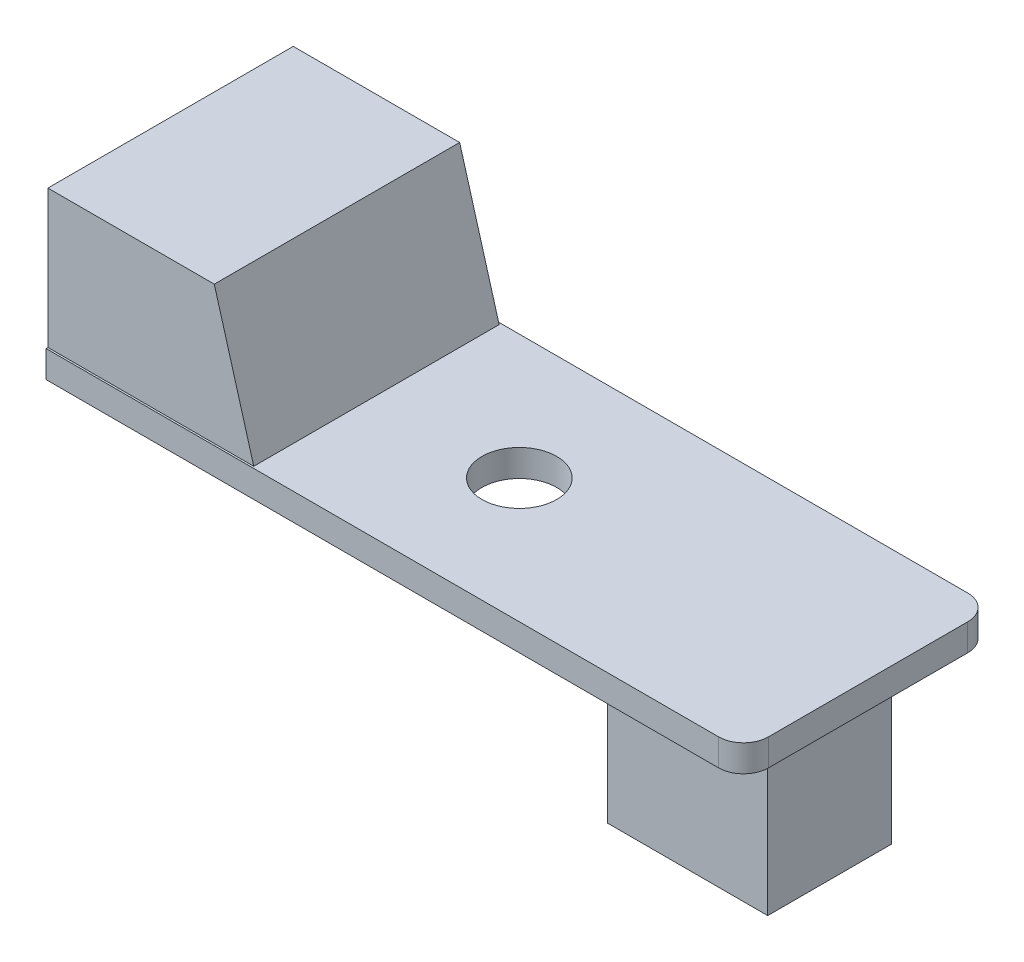
ISO-10303-21;
HEADER;
FILE_DESCRIPTION(('STEP AP214'),'2;1');
FILE_NAME('part.step','',(''),(''),'','','');
FILE_SCHEMA(('AUTOMOTIVE_DESIGN { 1 0 10303 214 1 1 1 1 }'));
ENDSEC;
DATA;
#1=APPLICATION_CONTEXT('core data for automotive mechanical design processes');
#2=APPLICATION_PROTOCOL_DEFINITION('international standard','automotive_design',2000,#1);
#3=PRODUCT_CONTEXT('',#1,'mechanical');
#4=PRODUCT('Part','Part','',(#3));
#5=PRODUCT_RELATED_PRODUCT_CATEGORY('part','',(#4));
#6=PRODUCT_DEFINITION_FORMATION('','',#4);
#7=PRODUCT_DEFINITION_CONTEXT('part definition',#1,'design');
#8=PRODUCT_DEFINITION('design','',#6,#7);
#9=PRODUCT_DEFINITION_SHAPE('','',#8);
#10=(LENGTH_UNIT() NAMED_UNIT(*) SI_UNIT(.MILLI.,.METRE.));
#11=(NAMED_UNIT(*) PLANE_ANGLE_UNIT() SI_UNIT($,.RADIAN.));
#12=(NAMED_UNIT(*) SI_UNIT($,.STERADIAN.) SOLID_ANGLE_UNIT());
#13=UNCERTAINTY_MEASURE_WITH_UNIT(LENGTH_MEASURE(1.E-05),#10,'distance_accuracy_value','');
#14=(GEOMETRIC_REPRESENTATION_CONTEXT(3) GLOBAL_UNCERTAINTY_ASSIGNED_CONTEXT((#13)) GLOBAL_UNIT_ASSIGNED_CONTEXT((#10,
#11,#12)) REPRESENTATION_CONTEXT('',''));
#15=CARTESIAN_POINT('',(0.,0.,0.));
#16=DIRECTION('',(0.,0.,1.));
#17=DIRECTION('',(1.,0.,0.));
#18=AXIS2_PLACEMENT_3D('',#15,#16,#17);
#19=CARTESIAN_POINT('',(27.,0.,-1.));
#20=DIRECTION('',(0.,1.,0.));
#21=DIRECTION('',(0.,0.,1.));
#22=AXIS2_PLACEMENT_3D('',#19,#20,#21);
#23=PLANE('',#22);
#24=CARTESIAN_POINT('',(14.,0.,-5.));
#25=DIRECTION('',(0.,1.,0.));
#26=DIRECTION('',(0.,0.,1.));
#27=AXIS2_PLACEMENT_3D('',#24,#25,#26);
#28=CIRCLE('',#27,1.5);
#29=CARTESIAN_POINT('',(14.,0.,-3.5));
#30=VERTEX_POINT('',#29);
#31=EDGE_CURVE('E218',#30,#30,#28,.T.);
#32=ORIENTED_EDGE('',*,*,#31,.T.);
#33=EDGE_LOOP('',(#32));
#34=FACE_BOUND('',#33,.T.);
#35=DIRECTION('',(0.,0.,1.));
#36=VECTOR('',#35,1.);
#37=CARTESIAN_POINT('',(0.,0.,-10.));
#38=LINE('',#37,#36);
#39=CARTESIAN_POINT('',(0.,0.,-10.));
#40=VERTEX_POINT('',#39);
#41=CARTESIAN_POINT('',(0.,0.,0.));
#42=VERTEX_POINT('',#41);
#43=EDGE_CURVE('E223',#40,#42,#38,.T.);
#44=ORIENTED_EDGE('',*,*,#43,.F.);
#45=DIRECTION('',(-1.,0.,0.));
#46=VECTOR('',#45,1.);
#47=CARTESIAN_POINT('',(27.,0.,-10.));
#48=LINE('',#47,#46);
#49=CARTESIAN_POINT('',(27.,0.,-10.));
#50=VERTEX_POINT('',#49);
#51=EDGE_CURVE('E262',#50,#40,#48,.T.);
#52=ORIENTED_EDGE('',*,*,#51,.F.);
#53=CARTESIAN_POINT('',(27.,0.,-9.));
#54=DIRECTION('',(0.,1.,0.));
#55=DIRECTION('',(0.,0.,1.));
#56=AXIS2_PLACEMENT_3D('',#53,#54,#55);
#57=CIRCLE('',#56,1.);
#58=CARTESIAN_POINT('',(28.,0.,-8.99999999999999));
#59=VERTEX_POINT('',#58);
#60=EDGE_CURVE('E259',#59,#50,#57,.T.);
#61=ORIENTED_EDGE('',*,*,#60,.F.);
#62=DIRECTION('',(0.,0.,-1.));
#63=VECTOR('',#62,1.);
#64=CARTESIAN_POINT('',(28.,0.,-1.00000000000001));
#65=LINE('',#64,#63);
#66=CARTESIAN_POINT('',(28.,0.,-1.00000000000001));
#67=VERTEX_POINT('',#66);
#68=EDGE_CURVE('E256',#67,#59,#65,.T.);
#69=ORIENTED_EDGE('',*,*,#68,.F.);
#70=CARTESIAN_POINT('',(27.,0.,-1.));
#71=DIRECTION('',(0.,1.,0.));
#72=DIRECTION('',(0.,0.,1.));
#73=AXIS2_PLACEMENT_3D('',#70,#71,#72);
#74=CIRCLE('',#73,1.);
#75=CARTESIAN_POINT('',(27.,0.,0.));
#76=VERTEX_POINT('',#75);
#77=EDGE_CURVE('E253',#76,#67,#74,.T.);
#78=ORIENTED_EDGE('',*,*,#77,.F.);
#79=DIRECTION('',(1.,0.,0.));
#80=VECTOR('',#79,1.);
#81=CARTESIAN_POINT('',(0.,0.,0.));
#82=LINE('',#81,#80);
#83=EDGE_CURVE('E250',#42,#76,#82,.T.);
#84=ORIENTED_EDGE('',*,*,#83,.F.);
#85=EDGE_LOOP('',(#44,#52,#61,#69,#78,#84));
#86=FACE_BOUND('',#85,.T.);
#87=DIRECTION('',(-1.,0.,0.));
#88=VECTOR('',#87,1.);
#89=CARTESIAN_POINT('',(26.45,0.,-2.52));
#90=LINE('',#89,#88);
#91=CARTESIAN_POINT('',(26.45,0.,-2.52));
#92=VERTEX_POINT('',#91);
#93=CARTESIAN_POINT('',(20.02,0.,-2.52));
#94=VERTEX_POINT('',#93);
#95=EDGE_CURVE('E169',#92,#94,#90,.T.);
#96=ORIENTED_EDGE('',*,*,#95,.F.);
#97=DIRECTION('',(0.,0.,1.));
#98=VECTOR('',#97,1.);
#99=CARTESIAN_POINT('',(26.45,0.,-7.48));
#100=LINE('',#99,#98);
#101=CARTESIAN_POINT('',(26.45,0.,-7.48));
#102=VERTEX_POINT('',#101);
#103=EDGE_CURVE('E166',#102,#92,#100,.T.);
#104=ORIENTED_EDGE('',*,*,#103,.F.);
#105=DIRECTION('',(1.,0.,0.));
#106=VECTOR('',#105,1.);
#107=CARTESIAN_POINT('',(20.02,0.,-7.48));
#108=LINE('',#107,#106);
#109=CARTESIAN_POINT('',(20.02,0.,-7.48));
#110=VERTEX_POINT('',#109);
#111=EDGE_CURVE('E66',#110,#102,#108,.T.);
#112=ORIENTED_EDGE('',*,*,#111,.F.);
#113=DIRECTION('',(0.,0.,-1.));
#114=VECTOR('',#113,1.);
#115=CARTESIAN_POINT('',(20.02,0.,-2.52));
#116=LINE('',#115,#114);
#117=EDGE_CURVE('E61',#94,#110,#116,.T.);
#118=ORIENTED_EDGE('',*,*,#117,.F.);
#119=EDGE_LOOP('',(#96,#104,#112,#118));
#120=FACE_BOUND('',#119,.T.);
#121=ADVANCED_FACE('F45',(#34,#86,#120),#23,.F.);
#122=CARTESIAN_POINT('',(27.,1.08,-1.));
#123=DIRECTION('',(0.,1.,0.));
#124=DIRECTION('',(0.,0.,1.));
#125=AXIS2_PLACEMENT_3D('',#122,#123,#124);
#126=PLANE('',#125);
#127=CARTESIAN_POINT('',(14.,1.08,-5.));
#128=DIRECTION('',(0.,1.,0.));
#129=DIRECTION('',(0.,0.,1.));
#130=AXIS2_PLACEMENT_3D('',#127,#128,#129);
#131=CIRCLE('',#130,1.5);
#132=CARTESIAN_POINT('',(14.,1.08,-3.5));
#133=VERTEX_POINT('',#132);
#134=EDGE_CURVE('E219',#133,#133,#131,.T.);
#135=ORIENTED_EDGE('',*,*,#134,.F.);
#136=EDGE_LOOP('',(#135));
#137=FACE_BOUND('',#136,.T.);
#138=DIRECTION('',(-1.,0.,0.));
#139=VECTOR('',#138,1.);
#140=CARTESIAN_POINT('',(0.,1.08,-9.925));
#141=LINE('',#140,#139);
#142=CARTESIAN_POINT('',(8.26460256565403,1.08,-9.925));
#143=VERTEX_POINT('',#142);
#144=CARTESIAN_POINT('',(0.,1.08,-9.925));
#145=VERTEX_POINT('',#144);
#146=EDGE_CURVE('E194',#143,#145,#141,.T.);
#147=ORIENTED_EDGE('',*,*,#146,.F.);
#148=DIRECTION('',(0.,0.,1.));
#149=VECTOR('',#148,1.);
#150=CARTESIAN_POINT('',(8.26460256565403,1.08,-9.925));
#151=LINE('',#150,#149);
#152=CARTESIAN_POINT('',(8.26460256565403,1.08,-0.0750000000000019));
#153=VERTEX_POINT('',#152);
#154=EDGE_CURVE('E183',#143,#153,#151,.T.);
#155=ORIENTED_EDGE('',*,*,#154,.T.);
#156=DIRECTION('',(1.,0.,0.));
#157=VECTOR('',#156,1.);
#158=CARTESIAN_POINT('',(6.68,1.08,-0.0750000000000024));
#159=LINE('',#158,#157);
#160=CARTESIAN_POINT('',(0.,1.08,-0.0750000000000021));
#161=VERTEX_POINT('',#160);
#162=EDGE_CURVE('E188',#161,#153,#159,.T.);
#163=ORIENTED_EDGE('',*,*,#162,.F.);
#164=DIRECTION('',(0.,0.,1.));
#165=VECTOR('',#164,1.);
#166=CARTESIAN_POINT('',(0.,1.08,-10.));
#167=LINE('',#166,#165);
#168=CARTESIAN_POINT('',(0.,1.08,0.));
#169=VERTEX_POINT('',#168);
#170=EDGE_CURVE('E231',#161,#169,#167,.T.);
#171=ORIENTED_EDGE('',*,*,#170,.T.);
#172=DIRECTION('',(1.,0.,0.));
#173=VECTOR('',#172,1.);
#174=CARTESIAN_POINT('',(0.,1.08,0.));
#175=LINE('',#174,#173);
#176=CARTESIAN_POINT('',(27.,1.08,0.));
#177=VERTEX_POINT('',#176);
#178=EDGE_CURVE('E230',#169,#177,#175,.T.);
#179=ORIENTED_EDGE('',*,*,#178,.T.);
#180=CARTESIAN_POINT('',(27.,1.08,-1.));
#181=DIRECTION('',(0.,1.,0.));
#182=DIRECTION('',(0.,0.,1.));
#183=AXIS2_PLACEMENT_3D('',#180,#181,#182);
#184=CIRCLE('',#183,1.);
#185=CARTESIAN_POINT('',(28.,1.08,-1.00000000000001));
#186=VERTEX_POINT('',#185);
#187=EDGE_CURVE('E234',#177,#186,#184,.T.);
#188=ORIENTED_EDGE('',*,*,#187,.T.);
#189=DIRECTION('',(0.,0.,-1.));
#190=VECTOR('',#189,1.);
#191=CARTESIAN_POINT('',(28.,1.08,-1.00000000000001));
#192=LINE('',#191,#190);
#193=CARTESIAN_POINT('',(28.,1.08,-8.99999999999999));
#194=VERTEX_POINT('',#193);
#195=EDGE_CURVE('E237',#186,#194,#192,.T.);
#196=ORIENTED_EDGE('',*,*,#195,.T.);
#197=CARTESIAN_POINT('',(27.,1.08,-9.));
#198=DIRECTION('',(0.,1.,0.));
#199=DIRECTION('',(0.,0.,1.));
#200=AXIS2_PLACEMENT_3D('',#197,#198,#199);
#201=CIRCLE('',#200,1.);
#202=CARTESIAN_POINT('',(27.,1.08,-10.));
#203=VERTEX_POINT('',#202);
#204=EDGE_CURVE('E240',#194,#203,#201,.T.);
#205=ORIENTED_EDGE('',*,*,#204,.T.);
#206=DIRECTION('',(-1.,0.,0.));
#207=VECTOR('',#206,1.);
#208=CARTESIAN_POINT('',(27.,1.08,-10.));
#209=LINE('',#208,#207);
#210=CARTESIAN_POINT('',(0.,1.08,-10.));
#211=VERTEX_POINT('',#210);
#212=EDGE_CURVE('E243',#203,#211,#209,.T.);
#213=ORIENTED_EDGE('',*,*,#212,.T.);
#214=EDGE_CURVE('E227',#211,#145,#167,.T.);
#215=ORIENTED_EDGE('',*,*,#214,.T.);
#216=EDGE_LOOP('',(#147,#155,#163,#171,#179,#188,#196,#205,#213,#215));
#217=FACE_BOUND('',#216,.T.);
#218=ADVANCED_FACE('F304',(#137,#217),#126,.T.);
#219=CARTESIAN_POINT('',(0.,1.08,-10.));
#220=DIRECTION('',(1.,0.,0.));
#221=DIRECTION('',(0.,0.,-1.));
#222=AXIS2_PLACEMENT_3D('',#219,#220,#221);
#223=PLANE('',#222);
#224=ORIENTED_EDGE('',*,*,#170,.F.);
#225=DIRECTION('',(0.,-1.,0.));
#226=VECTOR('',#225,1.);
#227=CARTESIAN_POINT('',(0.,6.62,-0.0750000000000019));
#228=LINE('',#227,#226);
#229=CARTESIAN_POINT('',(0.,6.62,-0.0750000000000019));
#230=VERTEX_POINT('',#229);
#231=EDGE_CURVE('E214',#230,#161,#228,.T.);
#232=ORIENTED_EDGE('',*,*,#231,.F.);
#233=DIRECTION('',(0.,0.,1.));
#234=VECTOR('',#233,1.);
#235=CARTESIAN_POINT('',(0.,6.62,-0.0750000000000019));
#236=LINE('',#235,#234);
#237=CARTESIAN_POINT('',(0.,6.62,-9.925));
#238=VERTEX_POINT('',#237);
#239=EDGE_CURVE('E189',#238,#230,#236,.T.);
#240=ORIENTED_EDGE('',*,*,#239,.F.);
#241=DIRECTION('',(0.,-1.,0.));
#242=VECTOR('',#241,1.);
#243=CARTESIAN_POINT('',(0.,6.62,-9.925));
#244=LINE('',#243,#242);
#245=EDGE_CURVE('E205',#238,#145,#244,.T.);
#246=ORIENTED_EDGE('',*,*,#245,.T.);
#247=ORIENTED_EDGE('',*,*,#214,.F.);
#248=DIRECTION('',(0.,-1.,0.));
#249=VECTOR('',#248,1.);
#250=CARTESIAN_POINT('',(0.,1.08,-10.));
#251=LINE('',#250,#249);
#252=EDGE_CURVE('E246',#211,#40,#251,.T.);
#253=ORIENTED_EDGE('',*,*,#252,.T.);
#254=ORIENTED_EDGE('',*,*,#43,.T.);
#255=DIRECTION('',(0.,-1.,0.));
#256=VECTOR('',#255,1.);
#257=CARTESIAN_POINT('',(0.,1.08,0.));
#258=LINE('',#257,#256);
#259=EDGE_CURVE('E11',#169,#42,#258,.T.);
#260=ORIENTED_EDGE('',*,*,#259,.F.);
#261=EDGE_LOOP('',(#224,#232,#240,#246,#247,#253,#254,#260));
#262=FACE_BOUND('',#261,.T.);
#263=ADVANCED_FACE('F47',(#262),#223,.F.);
#264=CARTESIAN_POINT('',(0.,1.08,0.));
#265=DIRECTION('',(0.,0.,-1.));
#266=DIRECTION('',(-1.,0.,0.));
#267=AXIS2_PLACEMENT_3D('',#264,#265,#266);
#268=PLANE('',#267);
#269=ORIENTED_EDGE('',*,*,#83,.T.);
#270=DIRECTION('',(0.,-1.,0.));
#271=VECTOR('',#270,1.);
#272=CARTESIAN_POINT('',(27.,1.08,0.));
#273=LINE('',#272,#271);
#274=EDGE_CURVE('E54',#177,#76,#273,.T.);
#275=ORIENTED_EDGE('',*,*,#274,.F.);
#276=ORIENTED_EDGE('',*,*,#178,.F.);
#277=ORIENTED_EDGE('',*,*,#259,.T.);
#278=EDGE_LOOP('',(#269,#275,#276,#277));
#279=FACE_BOUND('',#278,.T.);
#280=ADVANCED_FACE('F308',(#279),#268,.F.);
#281=CARTESIAN_POINT('',(27.,1.08,-1.));
#282=DIRECTION('',(0.,-1.,0.));
#283=DIRECTION('',(0.,0.,-1.));
#284=AXIS2_PLACEMENT_3D('',#281,#282,#283);
#285=CYLINDRICAL_SURFACE('',#284,1.);
#286=ORIENTED_EDGE('',*,*,#77,.T.);
#287=DIRECTION('',(0.,-1.,0.));
#288=VECTOR('',#287,1.);
#289=CARTESIAN_POINT('',(28.,1.08,-1.00000000000001));
#290=LINE('',#289,#288);
#291=EDGE_CURVE('E276',#186,#67,#290,.T.);
#292=ORIENTED_EDGE('',*,*,#291,.F.);
#293=ORIENTED_EDGE('',*,*,#187,.F.);
#294=ORIENTED_EDGE('',*,*,#274,.T.);
#295=EDGE_LOOP('',(#286,#292,#293,#294));
#296=FACE_BOUND('',#295,.T.);
#297=ADVANCED_FACE('F285',(#296),#285,.T.);
#298=CARTESIAN_POINT('',(28.,1.08,-1.00000000000001));
#299=DIRECTION('',(-1.,0.,0.));
#300=DIRECTION('',(0.,0.,1.));
#301=AXIS2_PLACEMENT_3D('',#298,#299,#300);
#302=PLANE('',#301);
#303=ORIENTED_EDGE('',*,*,#68,.T.);
#304=DIRECTION('',(0.,-1.,0.));
#305=VECTOR('',#304,1.);
#306=CARTESIAN_POINT('',(28.,1.08,-8.99999999999999));
#307=LINE('',#306,#305);
#308=EDGE_CURVE('E272',#194,#59,#307,.T.);
#309=ORIENTED_EDGE('',*,*,#308,.F.);
#310=ORIENTED_EDGE('',*,*,#195,.F.);
#311=ORIENTED_EDGE('',*,*,#291,.T.);
#312=EDGE_LOOP('',(#303,#309,#310,#311));
#313=FACE_BOUND('',#312,.T.);
#314=ADVANCED_FACE('F296',(#313),#302,.F.);
#315=CARTESIAN_POINT('',(27.,1.08,-9.));
#316=DIRECTION('',(0.,-1.,0.));
#317=DIRECTION('',(0.,0.,-1.));
#318=AXIS2_PLACEMENT_3D('',#315,#316,#317);
#319=CYLINDRICAL_SURFACE('',#318,1.);
#320=ORIENTED_EDGE('',*,*,#60,.T.);
#321=DIRECTION('',(0.,-1.,0.));
#322=VECTOR('',#321,1.);
#323=CARTESIAN_POINT('',(27.,1.08,-10.));
#324=LINE('',#323,#322);
#325=EDGE_CURVE('E268',#203,#50,#324,.T.);
#326=ORIENTED_EDGE('',*,*,#325,.F.);
#327=ORIENTED_EDGE('',*,*,#204,.F.);
#328=ORIENTED_EDGE('',*,*,#308,.T.);
#329=EDGE_LOOP('',(#320,#326,#327,#328));
#330=FACE_BOUND('',#329,.T.);
#331=ADVANCED_FACE('F300',(#330),#319,.T.);
#332=CARTESIAN_POINT('',(27.,1.08,-10.));
#333=DIRECTION('',(0.,0.,1.));
#334=DIRECTION('',(1.,0.,0.));
#335=AXIS2_PLACEMENT_3D('',#332,#333,#334);
#336=PLANE('',#335);
#337=ORIENTED_EDGE('',*,*,#51,.T.);
#338=ORIENTED_EDGE('',*,*,#252,.F.);
#339=ORIENTED_EDGE('',*,*,#212,.F.);
#340=ORIENTED_EDGE('',*,*,#325,.T.);
#341=EDGE_LOOP('',(#337,#338,#339,#340));
#342=FACE_BOUND('',#341,.T.);
#343=ADVANCED_FACE('F313',(#342),#336,.F.);
#344=CARTESIAN_POINT('',(14.,1.08,-5.));
#345=DIRECTION('',(0.,-1.,0.));
#346=DIRECTION('',(0.,0.,-1.));
#347=AXIS2_PLACEMENT_3D('',#344,#345,#346);
#348=CYLINDRICAL_SURFACE('',#347,1.5);
#349=ORIENTED_EDGE('',*,*,#134,.T.);
#350=EDGE_LOOP('',(#349));
#351=FACE_BOUND('',#350,.T.);
#352=ORIENTED_EDGE('',*,*,#31,.F.);
#353=EDGE_LOOP('',(#352));
#354=FACE_BOUND('',#353,.T.);
#355=ADVANCED_FACE('F329',(#351,#354),#348,.F.);
#356=CARTESIAN_POINT('',(6.68,6.62,-0.0750000000000024));
#357=DIRECTION('',(0.,0.,-1.));
#358=DIRECTION('',(-1.,0.,0.));
#359=AXIS2_PLACEMENT_3D('',#356,#357,#358);
#360=PLANE('',#359);
#361=ORIENTED_EDGE('',*,*,#162,.T.);
#362=DIRECTION('',(-0.275001165895373,0.961443892671947,0.));
#363=VECTOR('',#362,1.);
#364=CARTESIAN_POINT('',(8.26460256565403,1.08,-0.0750000000000019));
#365=LINE('',#364,#363);
#366=CARTESIAN_POINT('',(6.68,6.62,-0.0750000000000019));
#367=VERTEX_POINT('',#366);
#368=EDGE_CURVE('E171',#153,#367,#365,.T.);
#369=ORIENTED_EDGE('',*,*,#368,.T.);
#370=DIRECTION('',(1.,0.,0.));
#371=VECTOR('',#370,1.);
#372=CARTESIAN_POINT('',(6.68,6.62,-0.0750000000000024));
#373=LINE('',#372,#371);
#374=EDGE_CURVE('E193',#230,#367,#373,.T.);
#375=ORIENTED_EDGE('',*,*,#374,.F.);
#376=ORIENTED_EDGE('',*,*,#231,.T.);
#377=EDGE_LOOP('',(#361,#369,#375,#376));
#378=FACE_BOUND('',#377,.T.);
#379=ADVANCED_FACE('F327',(#378),#360,.F.);
#380=CARTESIAN_POINT('',(0.,6.62,-9.925));
#381=DIRECTION('',(0.,0.,1.));
#382=DIRECTION('',(1.,0.,0.));
#383=AXIS2_PLACEMENT_3D('',#380,#381,#382);
#384=PLANE('',#383);
#385=ORIENTED_EDGE('',*,*,#146,.T.);
#386=ORIENTED_EDGE('',*,*,#245,.F.);
#387=DIRECTION('',(-1.,0.,0.));
#388=VECTOR('',#387,1.);
#389=CARTESIAN_POINT('',(0.,6.62,-9.925));
#390=LINE('',#389,#388);
#391=CARTESIAN_POINT('',(6.68,6.62,-9.925));
#392=VERTEX_POINT('',#391);
#393=EDGE_CURVE('E202',#392,#238,#390,.T.);
#394=ORIENTED_EDGE('',*,*,#393,.F.);
#395=DIRECTION('',(-0.275001165895373,0.961443892671947,0.));
#396=VECTOR('',#395,1.);
#397=CARTESIAN_POINT('',(8.26460256565403,1.08,-9.925));
#398=LINE('',#397,#396);
#399=EDGE_CURVE('E176',#143,#392,#398,.T.);
#400=ORIENTED_EDGE('',*,*,#399,.F.);
#401=EDGE_LOOP('',(#385,#386,#394,#400));
#402=FACE_BOUND('',#401,.T.);
#403=ADVANCED_FACE('F319',(#402),#384,.F.);
#404=CARTESIAN_POINT('',(0.,6.62,0.));
#405=DIRECTION('',(0.,-1.,0.));
#406=DIRECTION('',(0.,0.,-1.));
#407=AXIS2_PLACEMENT_3D('',#404,#405,#406);
#408=PLANE('',#407);
#409=ORIENTED_EDGE('',*,*,#239,.T.);
#410=ORIENTED_EDGE('',*,*,#374,.T.);
#411=DIRECTION('',(0.,0.,-1.));
#412=VECTOR('',#411,1.);
#413=CARTESIAN_POINT('',(6.68,6.62,-9.925));
#414=LINE('',#413,#412);
#415=EDGE_CURVE('E198',#367,#392,#414,.T.);
#416=ORIENTED_EDGE('',*,*,#415,.T.);
#417=ORIENTED_EDGE('',*,*,#393,.T.);
#418=EDGE_LOOP('',(#409,#410,#416,#417));
#419=FACE_BOUND('',#418,.T.);
#420=ADVANCED_FACE('F325',(#419),#408,.F.);
#421=CARTESIAN_POINT('',(8.26460256565403,1.08,-9.925));
#422=DIRECTION('',(0.961443892671947,0.275001165895373,0.));
#423=DIRECTION('',(-0.275001165895373,0.961443892671947,0.));
#424=AXIS2_PLACEMENT_3D('',#421,#422,#423);
#425=PLANE('',#424);
#426=ORIENTED_EDGE('',*,*,#368,.F.);
#427=ORIENTED_EDGE('',*,*,#154,.F.);
#428=ORIENTED_EDGE('',*,*,#399,.T.);
#429=ORIENTED_EDGE('',*,*,#415,.F.);
#430=EDGE_LOOP('',(#426,#427,#428,#429));
#431=FACE_BOUND('',#430,.T.);
#432=ADVANCED_FACE('F323',(#431),#425,.T.);
#433=CARTESIAN_POINT('',(26.45,-6.67,-2.52));
#434=DIRECTION('',(0.,0.,-1.));
#435=DIRECTION('',(-1.,0.,0.));
#436=AXIS2_PLACEMENT_3D('',#433,#434,#435);
#437=PLANE('',#436);
#438=ORIENTED_EDGE('',*,*,#95,.T.);
#439=DIRECTION('',(0.,1.,0.));
#440=VECTOR('',#439,1.);
#441=CARTESIAN_POINT('',(20.02,-6.67,-2.52));
#442=LINE('',#441,#440);
#443=CARTESIAN_POINT('',(20.02,-6.67,-2.52));
#444=VERTEX_POINT('',#443);
#445=EDGE_CURVE('E148',#444,#94,#442,.T.);
#446=ORIENTED_EDGE('',*,*,#445,.F.);
#447=DIRECTION('',(-1.,0.,0.));
#448=VECTOR('',#447,1.);
#449=CARTESIAN_POINT('',(26.45,-6.67,-2.52));
#450=LINE('',#449,#448);
#451=CARTESIAN_POINT('',(26.45,-6.67,-2.52));
#452=VERTEX_POINT('',#451);
#453=EDGE_CURVE('E156',#452,#444,#450,.T.);
#454=ORIENTED_EDGE('',*,*,#453,.F.);
#455=DIRECTION('',(0.,1.,0.));
#456=VECTOR('',#455,1.);
#457=CARTESIAN_POINT('',(26.45,-6.67,-2.52));
#458=LINE('',#457,#456);
#459=EDGE_CURVE('E561',#452,#92,#458,.T.);
#460=ORIENTED_EDGE('',*,*,#459,.T.);
#461=EDGE_LOOP('',(#438,#446,#454,#460));
#462=FACE_BOUND('',#461,.T.);
#463=ADVANCED_FACE('F168',(#462),#437,.F.);
#464=CARTESIAN_POINT('',(20.02,-6.67,-2.52));
#465=DIRECTION('',(1.,0.,0.));
#466=DIRECTION('',(0.,0.,-1.));
#467=AXIS2_PLACEMENT_3D('',#464,#465,#466);
#468=PLANE('',#467);
#469=ORIENTED_EDGE('',*,*,#117,.T.);
#470=DIRECTION('',(0.,1.,0.));
#471=VECTOR('',#470,1.);
#472=CARTESIAN_POINT('',(20.02,-6.67,-7.48));
#473=LINE('',#472,#471);
#474=CARTESIAN_POINT('',(20.02,-6.67,-7.48));
#475=VERTEX_POINT('',#474);
#476=EDGE_CURVE('E151',#475,#110,#473,.T.);
#477=ORIENTED_EDGE('',*,*,#476,.F.);
#478=DIRECTION('',(0.,0.,-1.));
#479=VECTOR('',#478,1.);
#480=CARTESIAN_POINT('',(20.02,-6.67,-2.52));
#481=LINE('',#480,#479);
#482=EDGE_CURVE('E144',#444,#475,#481,.T.);
#483=ORIENTED_EDGE('',*,*,#482,.F.);
#484=ORIENTED_EDGE('',*,*,#445,.T.);
#485=EDGE_LOOP('',(#469,#477,#483,#484));
#486=FACE_BOUND('',#485,.T.);
#487=ADVANCED_FACE('F146',(#486),#468,.F.);
#488=CARTESIAN_POINT('',(20.02,-6.67,-7.48));
#489=DIRECTION('',(0.,0.,1.));
#490=DIRECTION('',(1.,0.,0.));
#491=AXIS2_PLACEMENT_3D('',#488,#489,#490);
#492=PLANE('',#491);
#493=ORIENTED_EDGE('',*,*,#111,.T.);
#494=DIRECTION('',(0.,1.,0.));
#495=VECTOR('',#494,1.);
#496=CARTESIAN_POINT('',(26.45,-6.67,-7.48));
#497=LINE('',#496,#495);
#498=CARTESIAN_POINT('',(26.45,-6.67,-7.48));
#499=VERTEX_POINT('',#498);
#500=EDGE_CURVE('E178',#499,#102,#497,.T.);
#501=ORIENTED_EDGE('',*,*,#500,.F.);
#502=DIRECTION('',(1.,0.,0.));
#503=VECTOR('',#502,1.);
#504=CARTESIAN_POINT('',(20.02,-6.67,-7.48));
#505=LINE('',#504,#503);
#506=EDGE_CURVE('E155',#475,#499,#505,.T.);
#507=ORIENTED_EDGE('',*,*,#506,.F.);
#508=ORIENTED_EDGE('',*,*,#476,.T.);
#509=EDGE_LOOP('',(#493,#501,#507,#508));
#510=FACE_BOUND('',#509,.T.);
#511=ADVANCED_FACE('F397',(#510),#492,.F.);
#512=CARTESIAN_POINT('',(26.45,-6.67,-7.48));
#513=DIRECTION('',(-1.,0.,0.));
#514=DIRECTION('',(0.,0.,1.));
#515=AXIS2_PLACEMENT_3D('',#512,#513,#514);
#516=PLANE('',#515);
#517=ORIENTED_EDGE('',*,*,#103,.T.);
#518=ORIENTED_EDGE('',*,*,#459,.F.);
#519=DIRECTION('',(0.,0.,1.));
#520=VECTOR('',#519,1.);
#521=CARTESIAN_POINT('',(26.45,-6.67,-7.48));
#522=LINE('',#521,#520);
#523=EDGE_CURVE('E161',#499,#452,#522,.T.);
#524=ORIENTED_EDGE('',*,*,#523,.F.);
#525=ORIENTED_EDGE('',*,*,#500,.T.);
#526=EDGE_LOOP('',(#517,#518,#524,#525));
#527=FACE_BOUND('',#526,.T.);
#528=ADVANCED_FACE('F408',(#527),#516,.F.);
#529=CARTESIAN_POINT('',(0.,-6.67,0.));
#530=DIRECTION('',(0.,-1.,0.));
#531=DIRECTION('',(0.,0.,-1.));
#532=AXIS2_PLACEMENT_3D('',#529,#530,#531);
#533=PLANE('',#532);
#534=ORIENTED_EDGE('',*,*,#453,.T.);
#535=ORIENTED_EDGE('',*,*,#482,.T.);
#536=ORIENTED_EDGE('',*,*,#506,.T.);
#537=ORIENTED_EDGE('',*,*,#523,.T.);
#538=EDGE_LOOP('',(#534,#535,#536,#537));
#539=FACE_BOUND('',#538,.T.);
#540=ADVANCED_FACE('F159',(#539),#533,.T.);
#541=CLOSED_SHELL('',(#121,#218,#263,#280,#297,#314,#331,#343,#355,#379,#403,#420,#432,#463,
#487,#511,#528,#540));
#542=MANIFOLD_SOLID_BREP('B2',#541);
#543=ADVANCED_BREP_SHAPE_REPRESENTATION('',(#18,#542),#14);
#544=SHAPE_DEFINITION_REPRESENTATION(#9,#543);
ENDSEC;
END-ISO-10303-21;
